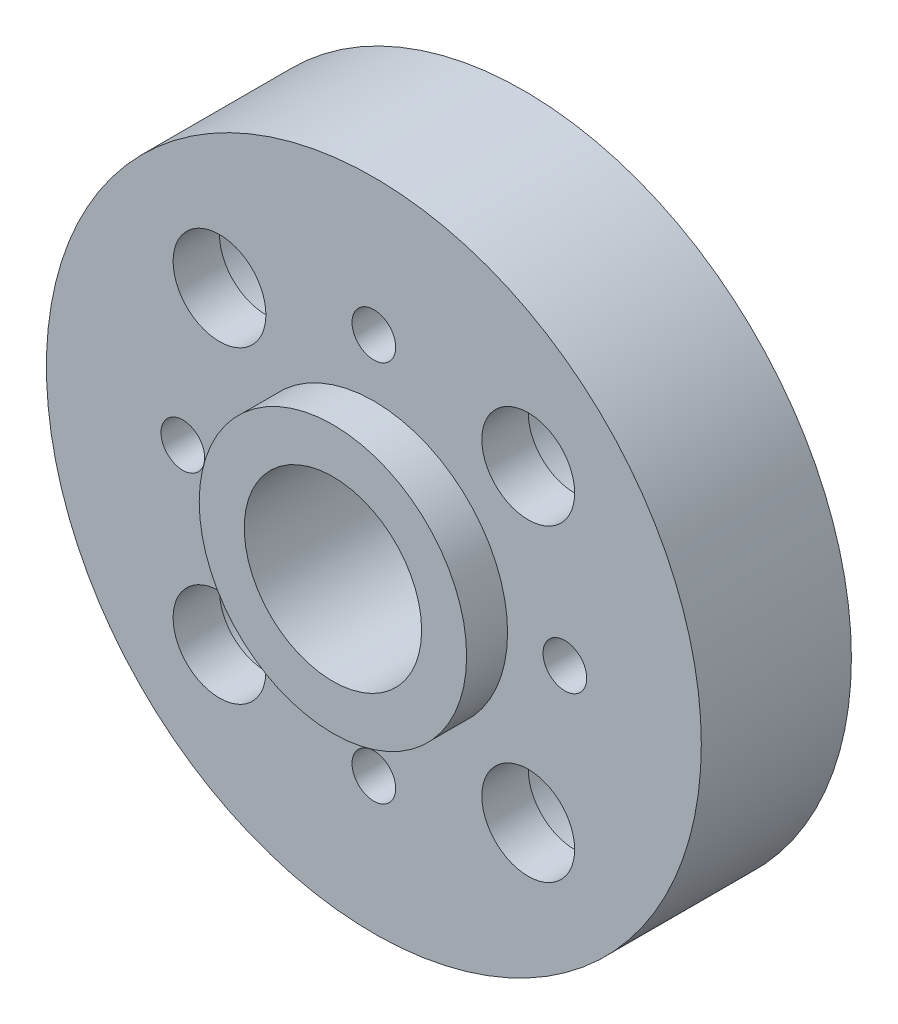
ISO-10303-21;
HEADER;
FILE_DESCRIPTION(('STEP AP214'),'2;1');
FILE_NAME('part.step','',(''),(''),'','','');
FILE_SCHEMA(('AUTOMOTIVE_DESIGN { 1 0 10303 214 1 1 1 1 }'));
ENDSEC;
DATA;
#1=APPLICATION_CONTEXT('core data for automotive mechanical design processes');
#2=APPLICATION_PROTOCOL_DEFINITION('international standard','automotive_design',2000,#1);
#3=PRODUCT_CONTEXT('',#1,'mechanical');
#4=PRODUCT('Part','Part','',(#3));
#5=PRODUCT_RELATED_PRODUCT_CATEGORY('part','',(#4));
#6=PRODUCT_DEFINITION_FORMATION('','',#4);
#7=PRODUCT_DEFINITION_CONTEXT('part definition',#1,'design');
#8=PRODUCT_DEFINITION('design','',#6,#7);
#9=PRODUCT_DEFINITION_SHAPE('','',#8);
#10=(LENGTH_UNIT() NAMED_UNIT(*) SI_UNIT(.MILLI.,.METRE.));
#11=(NAMED_UNIT(*) PLANE_ANGLE_UNIT() SI_UNIT($,.RADIAN.));
#12=(NAMED_UNIT(*) SI_UNIT($,.STERADIAN.) SOLID_ANGLE_UNIT());
#13=UNCERTAINTY_MEASURE_WITH_UNIT(LENGTH_MEASURE(1.E-05),#10,'distance_accuracy_value','');
#14=(GEOMETRIC_REPRESENTATION_CONTEXT(3) GLOBAL_UNCERTAINTY_ASSIGNED_CONTEXT((#13)) GLOBAL_UNIT_ASSIGNED_CONTEXT((#10,
#11,#12)) REPRESENTATION_CONTEXT('',''));
#15=CARTESIAN_POINT('',(0.,0.,0.));
#16=DIRECTION('',(0.,0.,1.));
#17=DIRECTION('',(1.,0.,0.));
#18=AXIS2_PLACEMENT_3D('',#15,#16,#17);
#19=CARTESIAN_POINT('',(0.,0.,0.));
#20=DIRECTION('',(0.,0.,1.));
#21=DIRECTION('',(1.,0.,0.));
#22=AXIS2_PLACEMENT_3D('',#19,#20,#21);
#23=PLANE('',#22);
#24=CARTESIAN_POINT('',(0.,0.,0.));
#25=DIRECTION('',(0.,0.,1.));
#26=DIRECTION('',(1.,0.,0.));
#27=AXIS2_PLACEMENT_3D('',#24,#25,#26);
#28=CIRCLE('',#27,12.);
#29=CARTESIAN_POINT('',(12.,0.,0.));
#30=VERTEX_POINT('',#29);
#31=EDGE_CURVE('E155',#30,#30,#28,.T.);
#32=ORIENTED_EDGE('',*,*,#31,.F.);
#33=EDGE_LOOP('',(#32));
#34=FACE_BOUND('',#33,.T.);
#35=CARTESIAN_POINT('',(5.65685424949238,5.65685424949238,0.));
#36=DIRECTION('',(0.,0.,-1.));
#37=DIRECTION('',(-1.,0.,0.));
#38=AXIS2_PLACEMENT_3D('',#35,#36,#37);
#39=CIRCLE('',#38,2.9);
#40=CARTESIAN_POINT('',(5.3054654352573,8.535486893862,0.));
#41=VERTEX_POINT('',#40);
#42=CARTESIAN_POINT('',(8.535486893862,5.3054654352573,0.));
#43=VERTEX_POINT('',#42);
#44=EDGE_CURVE('E122',#41,#43,#39,.T.);
#45=ORIENTED_EDGE('',*,*,#44,.F.);
#46=CARTESIAN_POINT('',(0.,0.,0.));
#47=DIRECTION('',(0.,0.,1.));
#48=DIRECTION('',(1.,0.,0.));
#49=AXIS2_PLACEMENT_3D('',#46,#47,#48);
#50=CIRCLE('',#49,10.05);
#51=CARTESIAN_POINT('',(-5.3054654352573,8.535486893862,0.));
#52=VERTEX_POINT('',#51);
#53=EDGE_CURVE('E130',#41,#52,#50,.T.);
#54=ORIENTED_EDGE('',*,*,#53,.T.);
#55=CARTESIAN_POINT('',(-5.65685424949238,5.65685424949238,0.));
#56=DIRECTION('',(0.,0.,-1.));
#57=DIRECTION('',(-1.,0.,0.));
#58=AXIS2_PLACEMENT_3D('',#55,#56,#57);
#59=CIRCLE('',#58,2.9);
#60=CARTESIAN_POINT('',(-8.535486893862,5.3054654352573,0.));
#61=VERTEX_POINT('',#60);
#62=EDGE_CURVE('E168',#61,#52,#59,.T.);
#63=ORIENTED_EDGE('',*,*,#62,.F.);
#64=CARTESIAN_POINT('',(-8.535486893862,-5.3054654352573,0.));
#65=VERTEX_POINT('',#64);
#66=EDGE_CURVE('E185',#61,#65,#50,.T.);
#67=ORIENTED_EDGE('',*,*,#66,.T.);
#68=CARTESIAN_POINT('',(-5.65685424949238,-5.65685424949238,0.));
#69=DIRECTION('',(0.,0.,-1.));
#70=DIRECTION('',(-1.,0.,0.));
#71=AXIS2_PLACEMENT_3D('',#68,#69,#70);
#72=CIRCLE('',#71,2.9);
#73=CARTESIAN_POINT('',(-5.3054654352573,-8.535486893862,0.));
#74=VERTEX_POINT('',#73);
#75=EDGE_CURVE('E171',#74,#65,#72,.T.);
#76=ORIENTED_EDGE('',*,*,#75,.F.);
#77=CARTESIAN_POINT('',(5.3054654352573,-8.535486893862,0.));
#78=VERTEX_POINT('',#77);
#79=EDGE_CURVE('E123',#74,#78,#50,.T.);
#80=ORIENTED_EDGE('',*,*,#79,.T.);
#81=CARTESIAN_POINT('',(5.65685424949238,-5.65685424949238,0.));
#82=DIRECTION('',(0.,0.,-1.));
#83=DIRECTION('',(-1.,0.,0.));
#84=AXIS2_PLACEMENT_3D('',#81,#82,#83);
#85=CIRCLE('',#84,2.9);
#86=CARTESIAN_POINT('',(8.535486893862,-5.3054654352573,0.));
#87=VERTEX_POINT('',#86);
#88=EDGE_CURVE('E121',#87,#78,#85,.T.);
#89=ORIENTED_EDGE('',*,*,#88,.F.);
#90=EDGE_CURVE('E107',#87,#43,#50,.T.);
#91=ORIENTED_EDGE('',*,*,#90,.T.);
#92=EDGE_LOOP('',(#45,#54,#63,#67,#76,#80,#89,#91));
#93=FACE_BOUND('',#92,.T.);
#94=ADVANCED_FACE('F43',(#34,#93),#23,.F.);
#95=CARTESIAN_POINT('',(5.65685424949238,5.65685424949238,0.));
#96=DIRECTION('',(0.,0.,-1.));
#97=DIRECTION('',(-1.,0.,0.));
#98=AXIS2_PLACEMENT_3D('',#95,#96,#97);
#99=CYLINDRICAL_SURFACE('',#98,2.9);
#100=CARTESIAN_POINT('',(5.65685424949238,5.65685424949238,3.8));
#101=DIRECTION('',(0.,0.,-1.));
#102=DIRECTION('',(-1.,0.,0.));
#103=AXIS2_PLACEMENT_3D('',#100,#101,#102);
#104=CIRCLE('',#103,2.9);
#105=CARTESIAN_POINT('',(2.75685424949238,5.65685424949238,3.8));
#106=VERTEX_POINT('',#105);
#107=EDGE_CURVE('E131',#106,#106,#104,.T.);
#108=ORIENTED_EDGE('',*,*,#107,.F.);
#109=EDGE_LOOP('',(#108));
#110=FACE_BOUND('',#109,.T.);
#111=DIRECTION('',(0.,0.,-1.));
#112=VECTOR('',#111,1.);
#113=CARTESIAN_POINT('',(5.3054654352573,8.535486893862,0.3));
#114=LINE('',#113,#112);
#115=CARTESIAN_POINT('',(5.3054654352573,8.535486893862,0.6));
#116=VERTEX_POINT('',#115);
#117=EDGE_CURVE('E112',#41,#116,#114,.F.);
#118=ORIENTED_EDGE('',*,*,#117,.F.);
#119=ORIENTED_EDGE('',*,*,#44,.T.);
#120=DIRECTION('',(0.,0.,-1.));
#121=VECTOR('',#120,1.);
#122=CARTESIAN_POINT('',(8.535486893862,5.3054654352573,0.3));
#123=LINE('',#122,#121);
#124=CARTESIAN_POINT('',(8.535486893862,5.3054654352573,0.6));
#125=VERTEX_POINT('',#124);
#126=EDGE_CURVE('E106',#125,#43,#123,.T.);
#127=ORIENTED_EDGE('',*,*,#126,.F.);
#128=CARTESIAN_POINT('',(5.65685424949238,5.65685424949238,0.6));
#129=DIRECTION('',(0.,0.,1.));
#130=DIRECTION('',(1.,0.,0.));
#131=AXIS2_PLACEMENT_3D('',#128,#129,#130);
#132=CIRCLE('',#131,2.9);
#133=EDGE_CURVE('E468',#125,#116,#132,.F.);
#134=ORIENTED_EDGE('',*,*,#133,.T.);
#135=EDGE_LOOP('',(#118,#119,#127,#134));
#136=FACE_BOUND('',#135,.T.);
#137=ADVANCED_FACE('F127',(#110,#136),#99,.F.);
#138=CARTESIAN_POINT('',(-5.65685424949238,5.65685424949238,0.));
#139=DIRECTION('',(0.,0.,-1.));
#140=DIRECTION('',(-1.,0.,0.));
#141=AXIS2_PLACEMENT_3D('',#138,#139,#140);
#142=CYLINDRICAL_SURFACE('',#141,2.9);
#143=CARTESIAN_POINT('',(-5.65685424949238,5.65685424949238,3.8));
#144=DIRECTION('',(0.,0.,-1.));
#145=DIRECTION('',(-1.,0.,0.));
#146=AXIS2_PLACEMENT_3D('',#143,#144,#145);
#147=CIRCLE('',#146,2.9);
#148=CARTESIAN_POINT('',(-8.55685424949238,5.65685424949238,3.8));
#149=VERTEX_POINT('',#148);
#150=EDGE_CURVE('E198',#149,#149,#147,.T.);
#151=ORIENTED_EDGE('',*,*,#150,.F.);
#152=EDGE_LOOP('',(#151));
#153=FACE_BOUND('',#152,.T.);
#154=DIRECTION('',(0.,0.,-1.));
#155=VECTOR('',#154,1.);
#156=CARTESIAN_POINT('',(-8.535486893862,5.3054654352573,0.3));
#157=LINE('',#156,#155);
#158=CARTESIAN_POINT('',(-8.535486893862,5.3054654352573,0.6));
#159=VERTEX_POINT('',#158);
#160=EDGE_CURVE('E114',#61,#159,#157,.F.);
#161=ORIENTED_EDGE('',*,*,#160,.F.);
#162=ORIENTED_EDGE('',*,*,#62,.T.);
#163=DIRECTION('',(0.,0.,-1.));
#164=VECTOR('',#163,1.);
#165=CARTESIAN_POINT('',(-5.3054654352573,8.535486893862,0.3));
#166=LINE('',#165,#164);
#167=CARTESIAN_POINT('',(-5.3054654352573,8.535486893862,0.6));
#168=VERTEX_POINT('',#167);
#169=EDGE_CURVE('E478',#168,#52,#166,.T.);
#170=ORIENTED_EDGE('',*,*,#169,.F.);
#171=CARTESIAN_POINT('',(-5.65685424949238,5.65685424949238,0.6));
#172=DIRECTION('',(0.,0.,1.));
#173=DIRECTION('',(1.,0.,0.));
#174=AXIS2_PLACEMENT_3D('',#171,#172,#173);
#175=CIRCLE('',#174,2.9);
#176=EDGE_CURVE('E470',#168,#159,#175,.F.);
#177=ORIENTED_EDGE('',*,*,#176,.T.);
#178=EDGE_LOOP('',(#161,#162,#170,#177));
#179=FACE_BOUND('',#178,.T.);
#180=ADVANCED_FACE('F230',(#153,#179),#142,.F.);
#181=CARTESIAN_POINT('',(-5.65685424949238,-5.65685424949238,0.));
#182=DIRECTION('',(0.,0.,-1.));
#183=DIRECTION('',(-1.,0.,0.));
#184=AXIS2_PLACEMENT_3D('',#181,#182,#183);
#185=CYLINDRICAL_SURFACE('',#184,2.9);
#186=CARTESIAN_POINT('',(-5.65685424949238,-5.65685424949238,3.8));
#187=DIRECTION('',(0.,0.,-1.));
#188=DIRECTION('',(-1.,0.,0.));
#189=AXIS2_PLACEMENT_3D('',#186,#187,#188);
#190=CIRCLE('',#189,2.9);
#191=CARTESIAN_POINT('',(-8.55685424949238,-5.65685424949238,3.8));
#192=VERTEX_POINT('',#191);
#193=EDGE_CURVE('E195',#192,#192,#190,.T.);
#194=ORIENTED_EDGE('',*,*,#193,.F.);
#195=EDGE_LOOP('',(#194));
#196=FACE_BOUND('',#195,.T.);
#197=DIRECTION('',(0.,0.,-1.));
#198=VECTOR('',#197,1.);
#199=CARTESIAN_POINT('',(-5.3054654352573,-8.535486893862,0.3));
#200=LINE('',#199,#198);
#201=CARTESIAN_POINT('',(-5.3054654352573,-8.535486893862,0.6));
#202=VERTEX_POINT('',#201);
#203=EDGE_CURVE('E480',#74,#202,#200,.F.);
#204=ORIENTED_EDGE('',*,*,#203,.F.);
#205=ORIENTED_EDGE('',*,*,#75,.T.);
#206=DIRECTION('',(0.,0.,-1.));
#207=VECTOR('',#206,1.);
#208=CARTESIAN_POINT('',(-8.535486893862,-5.3054654352573,0.3));
#209=LINE('',#208,#207);
#210=CARTESIAN_POINT('',(-8.535486893862,-5.3054654352573,0.6));
#211=VERTEX_POINT('',#210);
#212=EDGE_CURVE('E472',#211,#65,#209,.T.);
#213=ORIENTED_EDGE('',*,*,#212,.F.);
#214=CARTESIAN_POINT('',(-5.65685424949238,-5.65685424949238,0.6));
#215=DIRECTION('',(0.,0.,1.));
#216=DIRECTION('',(1.,0.,0.));
#217=AXIS2_PLACEMENT_3D('',#214,#215,#216);
#218=CIRCLE('',#217,2.9);
#219=EDGE_CURVE('E461',#211,#202,#218,.F.);
#220=ORIENTED_EDGE('',*,*,#219,.T.);
#221=EDGE_LOOP('',(#204,#205,#213,#220));
#222=FACE_BOUND('',#221,.T.);
#223=ADVANCED_FACE('F319',(#196,#222),#185,.F.);
#224=CARTESIAN_POINT('',(5.65685424949238,-5.65685424949238,0.));
#225=DIRECTION('',(0.,0.,-1.));
#226=DIRECTION('',(-1.,0.,0.));
#227=AXIS2_PLACEMENT_3D('',#224,#225,#226);
#228=CYLINDRICAL_SURFACE('',#227,2.9);
#229=CARTESIAN_POINT('',(5.65685424949238,-5.65685424949238,3.8));
#230=DIRECTION('',(0.,0.,-1.));
#231=DIRECTION('',(-1.,0.,0.));
#232=AXIS2_PLACEMENT_3D('',#229,#230,#231);
#233=CIRCLE('',#232,2.9);
#234=CARTESIAN_POINT('',(2.75685424949238,-5.65685424949238,3.8));
#235=VERTEX_POINT('',#234);
#236=EDGE_CURVE('E183',#235,#235,#233,.T.);
#237=ORIENTED_EDGE('',*,*,#236,.F.);
#238=EDGE_LOOP('',(#237));
#239=FACE_BOUND('',#238,.T.);
#240=DIRECTION('',(0.,0.,-1.));
#241=VECTOR('',#240,1.);
#242=CARTESIAN_POINT('',(8.535486893862,-5.3054654352573,0.3));
#243=LINE('',#242,#241);
#244=CARTESIAN_POINT('',(8.535486893862,-5.3054654352573,0.6));
#245=VERTEX_POINT('',#244);
#246=EDGE_CURVE('E11',#87,#245,#243,.F.);
#247=ORIENTED_EDGE('',*,*,#246,.F.);
#248=ORIENTED_EDGE('',*,*,#88,.T.);
#249=DIRECTION('',(0.,0.,-1.));
#250=VECTOR('',#249,1.);
#251=CARTESIAN_POINT('',(5.3054654352573,-8.535486893862,0.3));
#252=LINE('',#251,#250);
#253=CARTESIAN_POINT('',(5.3054654352573,-8.535486893862,0.6));
#254=VERTEX_POINT('',#253);
#255=EDGE_CURVE('E51',#254,#78,#252,.T.);
#256=ORIENTED_EDGE('',*,*,#255,.F.);
#257=CARTESIAN_POINT('',(5.65685424949238,-5.65685424949238,0.6));
#258=DIRECTION('',(0.,0.,1.));
#259=DIRECTION('',(1.,0.,0.));
#260=AXIS2_PLACEMENT_3D('',#257,#258,#259);
#261=CIRCLE('',#260,2.9);
#262=EDGE_CURVE('E61',#254,#245,#261,.F.);
#263=ORIENTED_EDGE('',*,*,#262,.T.);
#264=EDGE_LOOP('',(#247,#248,#256,#263));
#265=FACE_BOUND('',#264,.T.);
#266=ADVANCED_FACE('F182',(#239,#265),#228,.F.);
#267=CARTESIAN_POINT('',(0.,0.,5.5));
#268=DIRECTION('',(0.,0.,1.));
#269=DIRECTION('',(1.,0.,0.));
#270=AXIS2_PLACEMENT_3D('',#267,#268,#269);
#271=PLANE('',#270);
#272=CARTESIAN_POINT('',(0.,-7.,5.5));
#273=DIRECTION('',(0.,0.,1.));
#274=DIRECTION('',(1.,0.,0.));
#275=AXIS2_PLACEMENT_3D('',#272,#273,#274);
#276=CIRCLE('',#275,0.799999999999988);
#277=CARTESIAN_POINT('',(0.799999999999988,-7.,5.5));
#278=VERTEX_POINT('',#277);
#279=EDGE_CURVE('E438',#278,#278,#276,.T.);
#280=ORIENTED_EDGE('',*,*,#279,.F.);
#281=EDGE_LOOP('',(#280));
#282=FACE_BOUND('',#281,.T.);
#283=CARTESIAN_POINT('',(-7.,0.,5.5));
#284=DIRECTION('',(0.,0.,1.));
#285=DIRECTION('',(1.,0.,0.));
#286=AXIS2_PLACEMENT_3D('',#283,#284,#285);
#287=CIRCLE('',#286,0.799999999999987);
#288=CARTESIAN_POINT('',(-6.20000000000001,0.,5.5));
#289=VERTEX_POINT('',#288);
#290=EDGE_CURVE('E449',#289,#289,#287,.T.);
#291=ORIENTED_EDGE('',*,*,#290,.F.);
#292=EDGE_LOOP('',(#291));
#293=FACE_BOUND('',#292,.T.);
#294=CARTESIAN_POINT('',(0.,7.,5.5));
#295=DIRECTION('',(0.,0.,1.));
#296=DIRECTION('',(1.,0.,0.));
#297=AXIS2_PLACEMENT_3D('',#294,#295,#296);
#298=CIRCLE('',#297,0.799999999999988);
#299=CARTESIAN_POINT('',(0.799999999999988,7.,5.5));
#300=VERTEX_POINT('',#299);
#301=EDGE_CURVE('E453',#300,#300,#298,.T.);
#302=ORIENTED_EDGE('',*,*,#301,.F.);
#303=EDGE_LOOP('',(#302));
#304=FACE_BOUND('',#303,.T.);
#305=CARTESIAN_POINT('',(7.,0.,5.5));
#306=DIRECTION('',(0.,0.,1.));
#307=DIRECTION('',(1.,0.,0.));
#308=AXIS2_PLACEMENT_3D('',#305,#306,#307);
#309=CIRCLE('',#308,0.799999999999987);
#310=CARTESIAN_POINT('',(7.79999999999999,0.,5.5));
#311=VERTEX_POINT('',#310);
#312=EDGE_CURVE('E129',#311,#311,#309,.T.);
#313=ORIENTED_EDGE('',*,*,#312,.F.);
#314=EDGE_LOOP('',(#313));
#315=FACE_BOUND('',#314,.T.);
#316=CARTESIAN_POINT('',(5.65685424949238,-5.65685424949238,5.5));
#317=DIRECTION('',(0.,0.,1.));
#318=DIRECTION('',(1.,0.,0.));
#319=AXIS2_PLACEMENT_3D('',#316,#317,#318);
#320=CIRCLE('',#319,1.70000000000001);
#321=CARTESIAN_POINT('',(7.35685424949239,-5.65685424949238,5.5));
#322=VERTEX_POINT('',#321);
#323=EDGE_CURVE('E166',#322,#322,#320,.T.);
#324=ORIENTED_EDGE('',*,*,#323,.F.);
#325=EDGE_LOOP('',(#324));
#326=FACE_BOUND('',#325,.T.);
#327=CARTESIAN_POINT('',(-5.65685424949238,-5.65685424949238,5.5));
#328=DIRECTION('',(0.,0.,1.));
#329=DIRECTION('',(1.,0.,0.));
#330=AXIS2_PLACEMENT_3D('',#327,#328,#329);
#331=CIRCLE('',#330,1.70000000000001);
#332=CARTESIAN_POINT('',(-3.95685424949237,-5.65685424949238,5.5));
#333=VERTEX_POINT('',#332);
#334=EDGE_CURVE('E161',#333,#333,#331,.T.);
#335=ORIENTED_EDGE('',*,*,#334,.F.);
#336=EDGE_LOOP('',(#335));
#337=FACE_BOUND('',#336,.T.);
#338=CARTESIAN_POINT('',(-5.65685424949238,5.65685424949238,5.5));
#339=DIRECTION('',(0.,0.,1.));
#340=DIRECTION('',(1.,0.,0.));
#341=AXIS2_PLACEMENT_3D('',#338,#339,#340);
#342=CIRCLE('',#341,1.70000000000001);
#343=CARTESIAN_POINT('',(-3.95685424949237,5.65685424949238,5.5));
#344=VERTEX_POINT('',#343);
#345=EDGE_CURVE('E135',#344,#344,#342,.T.);
#346=ORIENTED_EDGE('',*,*,#345,.F.);
#347=EDGE_LOOP('',(#346));
#348=FACE_BOUND('',#347,.T.);
#349=CARTESIAN_POINT('',(5.65685424949238,5.65685424949238,5.5));
#350=DIRECTION('',(0.,0.,1.));
#351=DIRECTION('',(1.,0.,0.));
#352=AXIS2_PLACEMENT_3D('',#349,#350,#351);
#353=CIRCLE('',#352,1.70000000000001);
#354=CARTESIAN_POINT('',(7.35685424949239,5.65685424949238,5.5));
#355=VERTEX_POINT('',#354);
#356=EDGE_CURVE('E143',#355,#355,#353,.T.);
#357=ORIENTED_EDGE('',*,*,#356,.F.);
#358=EDGE_LOOP('',(#357));
#359=FACE_BOUND('',#358,.T.);
#360=CARTESIAN_POINT('',(0.,0.,5.5));
#361=DIRECTION('',(0.,0.,1.));
#362=DIRECTION('',(1.,0.,0.));
#363=AXIS2_PLACEMENT_3D('',#360,#361,#362);
#364=CIRCLE('',#363,4.9);
#365=CARTESIAN_POINT('',(4.9,0.,5.5));
#366=VERTEX_POINT('',#365);
#367=EDGE_CURVE('E152',#366,#366,#364,.T.);
#368=ORIENTED_EDGE('',*,*,#367,.F.);
#369=EDGE_LOOP('',(#368));
#370=FACE_BOUND('',#369,.T.);
#371=CARTESIAN_POINT('',(0.,0.,5.5));
#372=DIRECTION('',(0.,0.,1.));
#373=DIRECTION('',(1.,0.,0.));
#374=AXIS2_PLACEMENT_3D('',#371,#372,#373);
#375=CIRCLE('',#374,12.);
#376=CARTESIAN_POINT('',(12.,0.,5.5));
#377=VERTEX_POINT('',#376);
#378=EDGE_CURVE('E157',#377,#377,#375,.T.);
#379=ORIENTED_EDGE('',*,*,#378,.T.);
#380=EDGE_LOOP('',(#379));
#381=FACE_BOUND('',#380,.T.);
#382=ADVANCED_FACE('F234',(#282,#293,#304,#315,#326,#337,#348,#359,#370,#381),#271,.T.);
#383=CARTESIAN_POINT('',(0.,0.,5.5));
#384=DIRECTION('',(0.,0.,-1.));
#385=DIRECTION('',(-1.,0.,0.));
#386=AXIS2_PLACEMENT_3D('',#383,#384,#385);
#387=CYLINDRICAL_SURFACE('',#386,12.);
#388=ORIENTED_EDGE('',*,*,#378,.F.);
#389=EDGE_LOOP('',(#388));
#390=FACE_BOUND('',#389,.T.);
#391=ORIENTED_EDGE('',*,*,#31,.T.);
#392=EDGE_LOOP('',(#391));
#393=FACE_BOUND('',#392,.T.);
#394=ADVANCED_FACE('F44',(#390,#393),#387,.T.);
#395=CARTESIAN_POINT('',(0.,0.,5.5));
#396=DIRECTION('',(0.,0.,-1.));
#397=DIRECTION('',(-1.,0.,0.));
#398=AXIS2_PLACEMENT_3D('',#395,#396,#397);
#399=CYLINDRICAL_SURFACE('',#398,3.25);
#400=CARTESIAN_POINT('',(0.,0.,0.6));
#401=DIRECTION('',(0.,0.,1.));
#402=DIRECTION('',(1.,0.,0.));
#403=AXIS2_PLACEMENT_3D('',#400,#401,#402);
#404=CIRCLE('',#403,3.25);
#405=CARTESIAN_POINT('',(3.25,0.,0.6));
#406=VERTEX_POINT('',#405);
#407=EDGE_CURVE('E471',#406,#406,#404,.T.);
#408=ORIENTED_EDGE('',*,*,#407,.F.);
#409=EDGE_LOOP('',(#408));
#410=FACE_BOUND('',#409,.T.);
#411=CARTESIAN_POINT('',(0.,0.,7.));
#412=DIRECTION('',(0.,0.,1.));
#413=DIRECTION('',(1.,0.,0.));
#414=AXIS2_PLACEMENT_3D('',#411,#412,#413);
#415=CIRCLE('',#414,3.25);
#416=CARTESIAN_POINT('',(3.25,0.,7.));
#417=VERTEX_POINT('',#416);
#418=EDGE_CURVE('E149',#417,#417,#415,.T.);
#419=ORIENTED_EDGE('',*,*,#418,.T.);
#420=EDGE_LOOP('',(#419));
#421=FACE_BOUND('',#420,.T.);
#422=ADVANCED_FACE('F238',(#410,#421),#399,.F.);
#423=CARTESIAN_POINT('',(0.,0.,7.));
#424=DIRECTION('',(0.,0.,1.));
#425=DIRECTION('',(1.,0.,0.));
#426=AXIS2_PLACEMENT_3D('',#423,#424,#425);
#427=PLANE('',#426);
#428=CARTESIAN_POINT('',(0.,0.,7.));
#429=DIRECTION('',(0.,0.,1.));
#430=DIRECTION('',(1.,0.,0.));
#431=AXIS2_PLACEMENT_3D('',#428,#429,#430);
#432=CIRCLE('',#431,4.9);
#433=CARTESIAN_POINT('',(4.9,0.,7.));
#434=VERTEX_POINT('',#433);
#435=EDGE_CURVE('E148',#434,#434,#432,.T.);
#436=ORIENTED_EDGE('',*,*,#435,.T.);
#437=EDGE_LOOP('',(#436));
#438=FACE_BOUND('',#437,.T.);
#439=ORIENTED_EDGE('',*,*,#418,.F.);
#440=EDGE_LOOP('',(#439));
#441=FACE_BOUND('',#440,.T.);
#442=ADVANCED_FACE('F241',(#438,#441),#427,.T.);
#443=CARTESIAN_POINT('',(0.,0.,7.));
#444=DIRECTION('',(0.,0.,-1.));
#445=DIRECTION('',(-1.,0.,0.));
#446=AXIS2_PLACEMENT_3D('',#443,#444,#445);
#447=CYLINDRICAL_SURFACE('',#446,4.9);
#448=ORIENTED_EDGE('',*,*,#435,.F.);
#449=EDGE_LOOP('',(#448));
#450=FACE_BOUND('',#449,.T.);
#451=ORIENTED_EDGE('',*,*,#367,.T.);
#452=EDGE_LOOP('',(#451));
#453=FACE_BOUND('',#452,.T.);
#454=ADVANCED_FACE('F243',(#450,#453),#447,.T.);
#455=CARTESIAN_POINT('',(5.65685424949238,5.65685424949238,0.));
#456=DIRECTION('',(0.,0.,-1.));
#457=DIRECTION('',(-1.,0.,0.));
#458=AXIS2_PLACEMENT_3D('',#455,#456,#457);
#459=CYLINDRICAL_SURFACE('',#458,1.70000000000001);
#460=ORIENTED_EDGE('',*,*,#356,.T.);
#461=EDGE_LOOP('',(#460));
#462=FACE_BOUND('',#461,.T.);
#463=CARTESIAN_POINT('',(5.65685424949238,5.65685424949238,3.8));
#464=DIRECTION('',(0.,0.,-1.));
#465=DIRECTION('',(-1.,0.,0.));
#466=AXIS2_PLACEMENT_3D('',#463,#464,#465);
#467=CIRCLE('',#466,1.70000000000001);
#468=CARTESIAN_POINT('',(3.95685424949237,5.65685424949238,3.8));
#469=VERTEX_POINT('',#468);
#470=EDGE_CURVE('E134',#469,#469,#467,.T.);
#471=ORIENTED_EDGE('',*,*,#470,.T.);
#472=EDGE_LOOP('',(#471));
#473=FACE_BOUND('',#472,.T.);
#474=ADVANCED_FACE('F246',(#462,#473),#459,.F.);
#475=CARTESIAN_POINT('',(7.35685424949239,5.65685424949238,3.8));
#476=DIRECTION('',(0.,0.,1.));
#477=DIRECTION('',(1.,0.,0.));
#478=AXIS2_PLACEMENT_3D('',#475,#476,#477);
#479=PLANE('',#478);
#480=ORIENTED_EDGE('',*,*,#470,.F.);
#481=EDGE_LOOP('',(#480));
#482=FACE_BOUND('',#481,.T.);
#483=ORIENTED_EDGE('',*,*,#107,.T.);
#484=EDGE_LOOP('',(#483));
#485=FACE_BOUND('',#484,.T.);
#486=ADVANCED_FACE('F218',(#482,#485),#479,.F.);
#487=CARTESIAN_POINT('',(-5.65685424949238,5.65685424949238,0.));
#488=DIRECTION('',(0.,0.,-1.));
#489=DIRECTION('',(-1.,0.,0.));
#490=AXIS2_PLACEMENT_3D('',#487,#488,#489);
#491=CYLINDRICAL_SURFACE('',#490,1.70000000000001);
#492=ORIENTED_EDGE('',*,*,#345,.T.);
#493=EDGE_LOOP('',(#492));
#494=FACE_BOUND('',#493,.T.);
#495=CARTESIAN_POINT('',(-5.65685424949238,5.65685424949238,3.8));
#496=DIRECTION('',(0.,0.,-1.));
#497=DIRECTION('',(-1.,0.,0.));
#498=AXIS2_PLACEMENT_3D('',#495,#496,#497);
#499=CIRCLE('',#498,1.70000000000001);
#500=CARTESIAN_POINT('',(-7.35685424949239,5.65685424949238,3.8));
#501=VERTEX_POINT('',#500);
#502=EDGE_CURVE('E139',#501,#501,#499,.T.);
#503=ORIENTED_EDGE('',*,*,#502,.T.);
#504=EDGE_LOOP('',(#503));
#505=FACE_BOUND('',#504,.T.);
#506=ADVANCED_FACE('F207',(#494,#505),#491,.F.);
#507=CARTESIAN_POINT('',(-3.95685424949237,5.65685424949238,3.8));
#508=DIRECTION('',(0.,0.,1.));
#509=DIRECTION('',(1.,0.,0.));
#510=AXIS2_PLACEMENT_3D('',#507,#508,#509);
#511=PLANE('',#510);
#512=ORIENTED_EDGE('',*,*,#502,.F.);
#513=EDGE_LOOP('',(#512));
#514=FACE_BOUND('',#513,.T.);
#515=ORIENTED_EDGE('',*,*,#150,.T.);
#516=EDGE_LOOP('',(#515));
#517=FACE_BOUND('',#516,.T.);
#518=ADVANCED_FACE('F206',(#514,#517),#511,.F.);
#519=CARTESIAN_POINT('',(-5.65685424949238,-5.65685424949238,0.));
#520=DIRECTION('',(0.,0.,-1.));
#521=DIRECTION('',(-1.,0.,0.));
#522=AXIS2_PLACEMENT_3D('',#519,#520,#521);
#523=CYLINDRICAL_SURFACE('',#522,1.70000000000001);
#524=ORIENTED_EDGE('',*,*,#334,.T.);
#525=EDGE_LOOP('',(#524));
#526=FACE_BOUND('',#525,.T.);
#527=CARTESIAN_POINT('',(-5.65685424949238,-5.65685424949238,3.8));
#528=DIRECTION('',(0.,0.,-1.));
#529=DIRECTION('',(-1.,0.,0.));
#530=AXIS2_PLACEMENT_3D('',#527,#528,#529);
#531=CIRCLE('',#530,1.70000000000001);
#532=CARTESIAN_POINT('',(-7.35685424949239,-5.65685424949238,3.8));
#533=VERTEX_POINT('',#532);
#534=EDGE_CURVE('E170',#533,#533,#531,.T.);
#535=ORIENTED_EDGE('',*,*,#534,.T.);
#536=EDGE_LOOP('',(#535));
#537=FACE_BOUND('',#536,.T.);
#538=ADVANCED_FACE('F208',(#526,#537),#523,.F.);
#539=CARTESIAN_POINT('',(-3.95685424949237,-5.65685424949238,3.8));
#540=DIRECTION('',(0.,0.,1.));
#541=DIRECTION('',(1.,0.,0.));
#542=AXIS2_PLACEMENT_3D('',#539,#540,#541);
#543=PLANE('',#542);
#544=ORIENTED_EDGE('',*,*,#534,.F.);
#545=EDGE_LOOP('',(#544));
#546=FACE_BOUND('',#545,.T.);
#547=ORIENTED_EDGE('',*,*,#193,.T.);
#548=EDGE_LOOP('',(#547));
#549=FACE_BOUND('',#548,.T.);
#550=ADVANCED_FACE('F216',(#546,#549),#543,.F.);
#551=CARTESIAN_POINT('',(5.65685424949238,-5.65685424949238,0.));
#552=DIRECTION('',(0.,0.,-1.));
#553=DIRECTION('',(-1.,0.,0.));
#554=AXIS2_PLACEMENT_3D('',#551,#552,#553);
#555=CYLINDRICAL_SURFACE('',#554,1.70000000000001);
#556=ORIENTED_EDGE('',*,*,#323,.T.);
#557=EDGE_LOOP('',(#556));
#558=FACE_BOUND('',#557,.T.);
#559=CARTESIAN_POINT('',(5.65685424949238,-5.65685424949238,3.8));
#560=DIRECTION('',(0.,0.,-1.));
#561=DIRECTION('',(-1.,0.,0.));
#562=AXIS2_PLACEMENT_3D('',#559,#560,#561);
#563=CIRCLE('',#562,1.70000000000001);
#564=CARTESIAN_POINT('',(3.95685424949237,-5.65685424949238,3.8));
#565=VERTEX_POINT('',#564);
#566=EDGE_CURVE('E175',#565,#565,#563,.T.);
#567=ORIENTED_EDGE('',*,*,#566,.T.);
#568=EDGE_LOOP('',(#567));
#569=FACE_BOUND('',#568,.T.);
#570=ADVANCED_FACE('F286',(#558,#569),#555,.F.);
#571=CARTESIAN_POINT('',(7.35685424949239,-5.65685424949238,3.8));
#572=DIRECTION('',(0.,0.,1.));
#573=DIRECTION('',(1.,0.,0.));
#574=AXIS2_PLACEMENT_3D('',#571,#572,#573);
#575=PLANE('',#574);
#576=ORIENTED_EDGE('',*,*,#566,.F.);
#577=EDGE_LOOP('',(#576));
#578=FACE_BOUND('',#577,.T.);
#579=ORIENTED_EDGE('',*,*,#236,.T.);
#580=EDGE_LOOP('',(#579));
#581=FACE_BOUND('',#580,.T.);
#582=ADVANCED_FACE('F299',(#578,#581),#575,.F.);
#583=CARTESIAN_POINT('',(0.,0.,0.6));
#584=DIRECTION('',(0.,0.,-1.));
#585=DIRECTION('',(-1.,0.,0.));
#586=AXIS2_PLACEMENT_3D('',#583,#584,#585);
#587=CYLINDRICAL_SURFACE('',#586,10.05);
#588=ORIENTED_EDGE('',*,*,#117,.T.);
#589=CARTESIAN_POINT('',(0.,0.,0.6));
#590=DIRECTION('',(0.,0.,1.));
#591=DIRECTION('',(1.,0.,0.));
#592=AXIS2_PLACEMENT_3D('',#589,#590,#591);
#593=CIRCLE('',#592,10.05);
#594=EDGE_CURVE('E465',#116,#168,#593,.T.);
#595=ORIENTED_EDGE('',*,*,#594,.T.);
#596=ORIENTED_EDGE('',*,*,#169,.T.);
#597=ORIENTED_EDGE('',*,*,#53,.F.);
#598=EDGE_LOOP('',(#588,#595,#596,#597));
#599=FACE_BOUND('',#598,.T.);
#600=ADVANCED_FACE('F308',(#599),#587,.F.);
#601=ORIENTED_EDGE('',*,*,#126,.T.);
#602=ORIENTED_EDGE('',*,*,#90,.F.);
#603=ORIENTED_EDGE('',*,*,#246,.T.);
#604=EDGE_CURVE('E59',#245,#125,#593,.T.);
#605=ORIENTED_EDGE('',*,*,#604,.T.);
#606=EDGE_LOOP('',(#601,#602,#603,#605));
#607=FACE_BOUND('',#606,.T.);
#608=ADVANCED_FACE('F108',(#607),#587,.F.);
#609=ORIENTED_EDGE('',*,*,#160,.T.);
#610=EDGE_CURVE('E481',#159,#211,#593,.T.);
#611=ORIENTED_EDGE('',*,*,#610,.T.);
#612=ORIENTED_EDGE('',*,*,#212,.T.);
#613=ORIENTED_EDGE('',*,*,#66,.F.);
#614=EDGE_LOOP('',(#609,#611,#612,#613));
#615=FACE_BOUND('',#614,.T.);
#616=ADVANCED_FACE('F359',(#615),#587,.F.);
#617=ORIENTED_EDGE('',*,*,#203,.T.);
#618=EDGE_CURVE('E180',#202,#254,#593,.T.);
#619=ORIENTED_EDGE('',*,*,#618,.T.);
#620=ORIENTED_EDGE('',*,*,#255,.T.);
#621=ORIENTED_EDGE('',*,*,#79,.F.);
#622=EDGE_LOOP('',(#617,#619,#620,#621));
#623=FACE_BOUND('',#622,.T.);
#624=ADVANCED_FACE('F174',(#623),#587,.F.);
#625=CARTESIAN_POINT('',(0.,0.,0.6));
#626=DIRECTION('',(0.,0.,1.));
#627=DIRECTION('',(1.,0.,0.));
#628=AXIS2_PLACEMENT_3D('',#625,#626,#627);
#629=PLANE('',#628);
#630=CARTESIAN_POINT('',(0.,-7.,0.599999999999999));
#631=DIRECTION('',(0.,0.,-1.));
#632=DIRECTION('',(-1.,0.,0.));
#633=AXIS2_PLACEMENT_3D('',#630,#631,#632);
#634=CIRCLE('',#633,0.799999999999988);
#635=CARTESIAN_POINT('',(-0.799999999999988,-7.,0.599999999999999));
#636=VERTEX_POINT('',#635);
#637=EDGE_CURVE('E441',#636,#636,#634,.T.);
#638=ORIENTED_EDGE('',*,*,#637,.F.);
#639=EDGE_LOOP('',(#638));
#640=FACE_BOUND('',#639,.T.);
#641=CARTESIAN_POINT('',(-7.,0.,0.599999999999999));
#642=DIRECTION('',(0.,0.,-1.));
#643=DIRECTION('',(-1.,0.,0.));
#644=AXIS2_PLACEMENT_3D('',#641,#642,#643);
#645=CIRCLE('',#644,0.799999999999988);
#646=CARTESIAN_POINT('',(-7.79999999999999,0.,0.599999999999999));
#647=VERTEX_POINT('',#646);
#648=EDGE_CURVE('E442',#647,#647,#645,.T.);
#649=ORIENTED_EDGE('',*,*,#648,.F.);
#650=EDGE_LOOP('',(#649));
#651=FACE_BOUND('',#650,.T.);
#652=CARTESIAN_POINT('',(0.,7.,0.599999999999999));
#653=DIRECTION('',(0.,0.,-1.));
#654=DIRECTION('',(-1.,0.,0.));
#655=AXIS2_PLACEMENT_3D('',#652,#653,#654);
#656=CIRCLE('',#655,0.799999999999988);
#657=CARTESIAN_POINT('',(-0.799999999999988,7.,0.599999999999999));
#658=VERTEX_POINT('',#657);
#659=EDGE_CURVE('E454',#658,#658,#656,.T.);
#660=ORIENTED_EDGE('',*,*,#659,.F.);
#661=EDGE_LOOP('',(#660));
#662=FACE_BOUND('',#661,.T.);
#663=CARTESIAN_POINT('',(7.,0.,0.599999999999999));
#664=DIRECTION('',(0.,0.,-1.));
#665=DIRECTION('',(-1.,0.,0.));
#666=AXIS2_PLACEMENT_3D('',#663,#664,#665);
#667=CIRCLE('',#666,0.799999999999988);
#668=CARTESIAN_POINT('',(6.20000000000001,0.,0.599999999999999));
#669=VERTEX_POINT('',#668);
#670=EDGE_CURVE('E460',#669,#669,#667,.T.);
#671=ORIENTED_EDGE('',*,*,#670,.F.);
#672=EDGE_LOOP('',(#671));
#673=FACE_BOUND('',#672,.T.);
#674=ORIENTED_EDGE('',*,*,#407,.T.);
#675=EDGE_LOOP('',(#674));
#676=FACE_BOUND('',#675,.T.);
#677=ORIENTED_EDGE('',*,*,#604,.F.);
#678=ORIENTED_EDGE('',*,*,#262,.F.);
#679=ORIENTED_EDGE('',*,*,#618,.F.);
#680=ORIENTED_EDGE('',*,*,#219,.F.);
#681=ORIENTED_EDGE('',*,*,#610,.F.);
#682=ORIENTED_EDGE('',*,*,#176,.F.);
#683=ORIENTED_EDGE('',*,*,#594,.F.);
#684=ORIENTED_EDGE('',*,*,#133,.F.);
#685=EDGE_LOOP('',(#677,#678,#679,#680,#681,#682,#683,#684));
#686=FACE_BOUND('',#685,.T.);
#687=ADVANCED_FACE('F376',(#640,#651,#662,#673,#676,#686),#629,.F.);
#688=CARTESIAN_POINT('',(7.,0.,0.6));
#689=DIRECTION('',(0.,0.,-1.));
#690=DIRECTION('',(-1.,0.,0.));
#691=AXIS2_PLACEMENT_3D('',#688,#689,#690);
#692=CYLINDRICAL_SURFACE('',#691,0.799999999999987);
#693=ORIENTED_EDGE('',*,*,#312,.T.);
#694=EDGE_LOOP('',(#693));
#695=FACE_BOUND('',#694,.T.);
#696=ORIENTED_EDGE('',*,*,#670,.T.);
#697=EDGE_LOOP('',(#696));
#698=FACE_BOUND('',#697,.T.);
#699=ADVANCED_FACE('F381',(#695,#698),#692,.F.);
#700=CARTESIAN_POINT('',(0.,7.,0.6));
#701=DIRECTION('',(0.,0.,-1.));
#702=DIRECTION('',(-1.,0.,0.));
#703=AXIS2_PLACEMENT_3D('',#700,#701,#702);
#704=CYLINDRICAL_SURFACE('',#703,0.799999999999988);
#705=ORIENTED_EDGE('',*,*,#301,.T.);
#706=EDGE_LOOP('',(#705));
#707=FACE_BOUND('',#706,.T.);
#708=ORIENTED_EDGE('',*,*,#659,.T.);
#709=EDGE_LOOP('',(#708));
#710=FACE_BOUND('',#709,.T.);
#711=ADVANCED_FACE('F394',(#707,#710),#704,.F.);
#712=CARTESIAN_POINT('',(-7.,0.,0.6));
#713=DIRECTION('',(0.,0.,-1.));
#714=DIRECTION('',(-1.,0.,0.));
#715=AXIS2_PLACEMENT_3D('',#712,#713,#714);
#716=CYLINDRICAL_SURFACE('',#715,0.799999999999987);
#717=ORIENTED_EDGE('',*,*,#290,.T.);
#718=EDGE_LOOP('',(#717));
#719=FACE_BOUND('',#718,.T.);
#720=ORIENTED_EDGE('',*,*,#648,.T.);
#721=EDGE_LOOP('',(#720));
#722=FACE_BOUND('',#721,.T.);
#723=ADVANCED_FACE('F409',(#719,#722),#716,.F.);
#724=CARTESIAN_POINT('',(0.,-7.,0.6));
#725=DIRECTION('',(0.,0.,-1.));
#726=DIRECTION('',(-1.,0.,0.));
#727=AXIS2_PLACEMENT_3D('',#724,#725,#726);
#728=CYLINDRICAL_SURFACE('',#727,0.799999999999988);
#729=ORIENTED_EDGE('',*,*,#279,.T.);
#730=EDGE_LOOP('',(#729));
#731=FACE_BOUND('',#730,.T.);
#732=ORIENTED_EDGE('',*,*,#637,.T.);
#733=EDGE_LOOP('',(#732));
#734=FACE_BOUND('',#733,.T.);
#735=ADVANCED_FACE('F420',(#731,#734),#728,.F.);
#736=CLOSED_SHELL('',(#94,#137,#180,#223,#266,#382,#394,#422,#442,#454,#474,#486,#506,#518,#538,
#550,#570,#582,#600,#608,#616,#624,#687,#699,#711,#723,#735));
#737=MANIFOLD_SOLID_BREP('B2',#736);
#738=ADVANCED_BREP_SHAPE_REPRESENTATION('',(#18,#737),#14);
#739=SHAPE_DEFINITION_REPRESENTATION(#9,#738);
ENDSEC;
END-ISO-10303-21;
